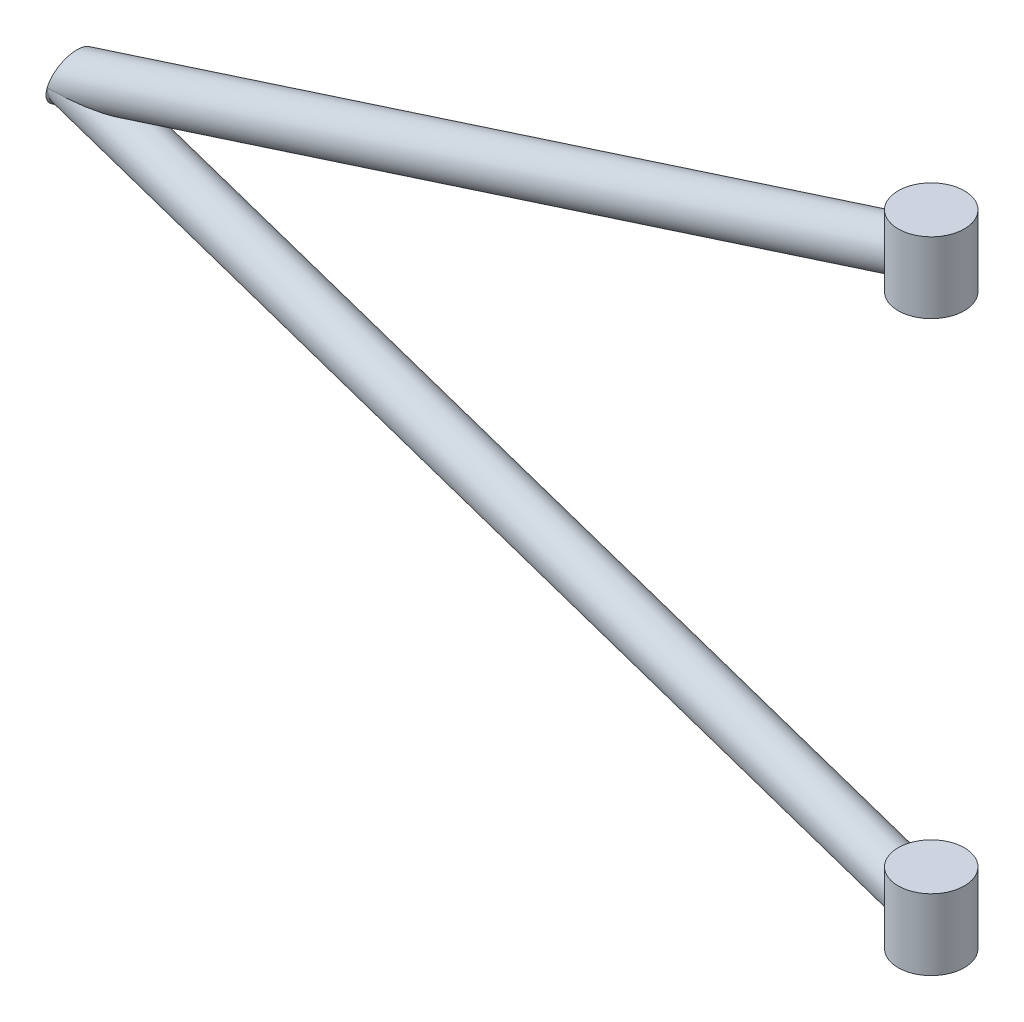
ISO-10303-21;
HEADER;
FILE_DESCRIPTION(('STEP AP214'),'2;1');
FILE_NAME('part.step','',(''),(''),'','','');
FILE_SCHEMA(('AUTOMOTIVE_DESIGN { 1 0 10303 214 1 1 1 1 }'));
ENDSEC;
DATA;
#1=APPLICATION_CONTEXT('core data for automotive mechanical design processes');
#2=APPLICATION_PROTOCOL_DEFINITION('international standard','automotive_design',2000,#1);
#3=PRODUCT_CONTEXT('',#1,'mechanical');
#4=PRODUCT('Part','Part','',(#3));
#5=PRODUCT_RELATED_PRODUCT_CATEGORY('part','',(#4));
#6=PRODUCT_DEFINITION_FORMATION('','',#4);
#7=PRODUCT_DEFINITION_CONTEXT('part definition',#1,'design');
#8=PRODUCT_DEFINITION('design','',#6,#7);
#9=PRODUCT_DEFINITION_SHAPE('','',#8);
#10=(LENGTH_UNIT() NAMED_UNIT(*) SI_UNIT(.MILLI.,.METRE.));
#11=(NAMED_UNIT(*) PLANE_ANGLE_UNIT() SI_UNIT($,.RADIAN.));
#12=(NAMED_UNIT(*) SI_UNIT($,.STERADIAN.) SOLID_ANGLE_UNIT());
#13=UNCERTAINTY_MEASURE_WITH_UNIT(LENGTH_MEASURE(1.E-05),#10,'distance_accuracy_value','');
#14=(GEOMETRIC_REPRESENTATION_CONTEXT(3) GLOBAL_UNCERTAINTY_ASSIGNED_CONTEXT((#13)) GLOBAL_UNIT_ASSIGNED_CONTEXT((#10,
#11,#12)) REPRESENTATION_CONTEXT('',''));
#15=CARTESIAN_POINT('',(0.,0.,0.));
#16=DIRECTION('',(0.,0.,1.));
#17=DIRECTION('',(1.,0.,0.));
#18=AXIS2_PLACEMENT_3D('',#15,#16,#17);
#19=CARTESIAN_POINT('',(-205.,-240.84,-42.383));
#20=DIRECTION('',(-0.959217140433101,0.280841487366859,-0.0321019699226643));
#21=DIRECTION('',(-0.280986308006609,-0.959711776895967,0.));
#22=AXIS2_PLACEMENT_3D('',#19,#20,#21);
#23=CYLINDRICAL_SURFACE('',#22,9.525);
#24=CARTESIAN_POINT('',(-218.994874606705,-246.667407757082,-42.7617937996007));
#25=CARTESIAN_POINT('',(-218.987955220855,-246.669433565251,-43.0174342762623));
#26=CARTESIAN_POINT('',(-218.97401688206,-246.662772486365,-43.27295474799));
#27=CARTESIAN_POINT('',(-218.932282379767,-246.632133179496,-43.7818138094207));
#28=CARTESIAN_POINT('',(-218.904486146226,-246.608154863986,-44.0351523880892));
#29=CARTESIAN_POINT('',(-218.835504698073,-246.543075469706,-44.5378028221887));
#30=CARTESIAN_POINT('',(-218.794317705473,-246.501972116916,-44.7871141382741));
#31=CARTESIAN_POINT('',(-218.699301450256,-246.402961792814,-45.2799146033767));
#32=CARTESIAN_POINT('',(-218.645472123492,-246.345054736238,-45.5234037228449));
#33=CARTESIAN_POINT('',(-218.526319202507,-246.213021164244,-46.0023119917565));
#34=CARTESIAN_POINT('',(-218.461026565887,-246.138938205086,-46.2377508856241));
#35=CARTESIAN_POINT('',(-218.320040046818,-245.974917515405,-46.6998139024592));
#36=CARTESIAN_POINT('',(-218.244346168744,-245.884979791551,-46.9264380291338));
#37=CARTESIAN_POINT('',(-218.08389833798,-245.689676950534,-47.3697005429419));
#38=CARTESIAN_POINT('',(-217.999141222411,-245.584306442881,-47.5863354060368));
#39=CARTESIAN_POINT('',(-217.822119282045,-245.358594623466,-48.0084459640598));
#40=CARTESIAN_POINT('',(-217.729854246826,-245.238252892057,-48.2139213459529));
#41=CARTESIAN_POINT('',(-217.534948518415,-244.976872080383,-48.6222837917232));
#42=CARTESIAN_POINT('',(-217.432022694602,-244.835118716989,-48.8245778697181));
#43=CARTESIAN_POINT('',(-217.221896241143,-244.535928211992,-49.2148648303007));
#44=CARTESIAN_POINT('',(-217.114695291446,-244.378489894835,-49.402856639099));
#45=CARTESIAN_POINT('',(-216.898362477643,-244.048180577292,-49.7635967071952));
#46=CARTESIAN_POINT('',(-216.789230433679,-243.875308133281,-49.9363435375497));
#47=CARTESIAN_POINT('',(-216.571660509932,-243.514353831896,-50.2656136509209));
#48=CARTESIAN_POINT('',(-216.463222541257,-243.326273965968,-50.4221390520658));
#49=CARTESIAN_POINT('',(-216.264220326347,-242.961298618952,-50.6981854444424));
#50=CARTESIAN_POINT('',(-216.173205475998,-242.78627233535,-50.8198556160698));
#51=CARTESIAN_POINT('',(-215.995970080119,-242.425218812917,-51.049584247466));
#52=CARTESIAN_POINT('',(-215.909748682027,-242.239193542585,-51.1576451321331));
#53=CARTESIAN_POINT('',(-215.744407552704,-241.856735287785,-51.3593412562569));
#54=CARTESIAN_POINT('',(-215.665280223016,-241.660313806317,-51.4529920093487));
#55=CARTESIAN_POINT('',(-215.516321457222,-241.257579756919,-51.6252921262342));
#56=CARTESIAN_POINT('',(-215.446489918048,-241.05126729869,-51.7039416563587));
#57=CARTESIAN_POINT('',(-215.317803840485,-240.628071385152,-51.8462034041527));
#58=CARTESIAN_POINT('',(-215.259046818851,-240.411113467368,-51.909683243731));
#59=CARTESIAN_POINT('',(-215.155219633012,-239.969861961161,-52.020286211168));
#60=CARTESIAN_POINT('',(-215.110149024423,-239.745568611173,-52.0674098701012));
#61=CARTESIAN_POINT('',(-215.035114059797,-239.291776283792,-52.1451418873722));
#62=CARTESIAN_POINT('',(-215.005141875268,-239.062280068711,-52.1757588049921));
#63=CARTESIAN_POINT('',(-214.960904175788,-238.60022316354,-52.2207532914588));
#64=CARTESIAN_POINT('',(-214.946637876694,-238.367662627028,-52.2351316710448));
#65=CARTESIAN_POINT('',(-214.934462330495,-237.931889003292,-52.2474060743877));
#66=CARTESIAN_POINT('',(-214.934674334689,-237.728774934088,-52.2471951922496));
#67=CARTESIAN_POINT('',(-214.946272200047,-237.3231667572,-52.2354973518725));
#68=CARTESIAN_POINT('',(-214.957662042179,-237.120672896176,-52.2240063762463));
#69=CARTESIAN_POINT('',(-215.007395627215,-236.515633118877,-52.173531168851));
#70=CARTESIAN_POINT('',(-215.06130394934,-236.115554578538,-52.11854409393));
#71=CARTESIAN_POINT('',(-215.186076494152,-235.417528598044,-51.9876791750984));
#72=CARTESIAN_POINT('',(-215.2503949685,-235.116858589203,-51.9192872042912));
#73=CARTESIAN_POINT('',(-215.394679087641,-234.524670152727,-51.7618103967004));
#74=CARTESIAN_POINT('',(-215.474652703699,-234.23315647542,-51.6727150138402));
#75=CARTESIAN_POINT('',(-215.646725198678,-233.659820147971,-51.474998603591));
#76=CARTESIAN_POINT('',(-215.738850563475,-233.378020413079,-51.3663347302394));
#77=CARTESIAN_POINT('',(-215.931829459448,-232.825465311702,-51.1304753857181));
#78=CARTESIAN_POINT('',(-216.03268171789,-232.554708343179,-51.0032826149703));
#79=CARTESIAN_POINT('',(-216.244044192548,-232.015286548897,-50.7258397779256));
#80=CARTESIAN_POINT('',(-216.354771601557,-231.747049849586,-50.5749232644513));
#81=CARTESIAN_POINT('',(-216.579772589072,-231.223977764963,-50.2536631642885));
#82=CARTESIAN_POINT('',(-216.694046579385,-230.969143945239,-50.083317315396));
#83=CARTESIAN_POINT('',(-216.923366646992,-230.474492862033,-49.7232209908667));
#84=CARTESIAN_POINT('',(-217.038411532887,-230.234656580738,-49.5334959281474));
#85=CARTESIAN_POINT('',(-217.266851998394,-229.771392873752,-49.1340926387977));
#86=CARTESIAN_POINT('',(-217.380247990623,-229.54796128426,-48.924419506577));
#87=CARTESIAN_POINT('',(-217.579029762873,-229.165450705871,-48.5316244719961));
#88=CARTESIAN_POINT('',(-217.665231156987,-229.002810444394,-48.352378047517));
#89=CARTESIAN_POINT('',(-217.833641429065,-228.690462230337,-47.981140996832));
#90=CARTESIAN_POINT('',(-217.91585042402,-228.540753898709,-47.7891507444516));
#91=CARTESIAN_POINT('',(-218.074741361708,-228.25606748022,-47.3926612102598));
#92=CARTESIAN_POINT('',(-218.151428657936,-228.121075058621,-47.1881744099565));
#93=CARTESIAN_POINT('',(-218.29779806036,-227.867582421436,-46.7668628644205));
#94=CARTESIAN_POINT('',(-218.367482456801,-227.749076809058,-46.5500421894554));
#95=CARTESIAN_POINT('',(-218.485650467373,-227.551651077602,-46.1476185131409));
#96=CARTESIAN_POINT('',(-218.53563334538,-227.469501743132,-45.9640373660615));
#97=CARTESIAN_POINT('',(-218.629100785317,-227.318477581283,-45.5899829371691));
#98=CARTESIAN_POINT('',(-218.672588961891,-227.249595363818,-45.399513562897));
#99=CARTESIAN_POINT('',(-218.752252884074,-227.126190758208,-45.0125514172378));
#100=CARTESIAN_POINT('',(-218.788431423442,-227.071662881378,-44.8160609803086));
#101=CARTESIAN_POINT('',(-218.852753563461,-226.977930863666,-44.4181481150666));
#102=CARTESIAN_POINT('',(-218.880897112861,-226.938726820525,-44.2167256553036));
#103=CARTESIAN_POINT('',(-218.928679422227,-226.876265296826,-43.809251974149));
#104=CARTESIAN_POINT('',(-218.948270097597,-226.853097557228,-43.6031812630704));
#105=CARTESIAN_POINT('',(-218.978310454204,-226.823570105098,-43.1891698130836));
#106=CARTESIAN_POINT('',(-218.988760137835,-226.817210388161,-42.9812290746653));
#107=CARTESIAN_POINT('',(-219.000359516121,-226.821442527581,-42.5652714040354));
#108=CARTESIAN_POINT('',(-219.001509581357,-226.832033708441,-42.3572544751904));
#109=CARTESIAN_POINT('',(-218.994615178529,-226.869928565337,-41.9429146229833));
#110=CARTESIAN_POINT('',(-218.986571029432,-226.897231661587,-41.7365916411051));
#111=CARTESIAN_POINT('',(-218.962695913651,-226.964973199112,-41.3445427845508));
#112=CARTESIAN_POINT('',(-218.947577939746,-227.004111468765,-41.1585458731584));
#113=CARTESIAN_POINT('',(-218.910349437195,-227.095258420623,-40.7903843252268));
#114=CARTESIAN_POINT('',(-218.888236318892,-227.147271867765,-40.6082211346407));
#115=CARTESIAN_POINT('',(-218.837551601546,-227.263364269701,-40.2487272936106));
#116=CARTESIAN_POINT('',(-218.808980288976,-227.327442689296,-40.0713964292054));
#117=CARTESIAN_POINT('',(-218.745977670174,-227.466803340716,-39.7222508201057));
#118=CARTESIAN_POINT('',(-218.711545112253,-227.542087965232,-39.550437262986));
#119=CARTESIAN_POINT('',(-218.622728814996,-227.734950479019,-39.1457876785846));
#120=CARTESIAN_POINT('',(-218.565853748616,-227.857447555666,-38.9158296783989));
#121=CARTESIAN_POINT('',(-218.443657560682,-228.120246039999,-38.4686868076348));
#122=CARTESIAN_POINT('',(-218.378333637436,-228.26055335338,-38.2515062090324));
#123=CARTESIAN_POINT('',(-218.24082479864,-228.557114147972,-37.8300016165915));
#124=CARTESIAN_POINT('',(-218.168626955244,-228.713397718229,-37.6257030988363));
#125=CARTESIAN_POINT('',(-218.019104613914,-229.039830739394,-37.230568586869));
#126=CARTESIAN_POINT('',(-217.941780020271,-229.20998044918,-37.0397328441282));
#127=CARTESIAN_POINT('',(-217.756482904016,-229.622868006897,-36.6085349683185));
#128=CARTESIAN_POINT('',(-217.647062349395,-229.870550541601,-36.3735169716761));
#129=CARTESIAN_POINT('',(-217.425182595827,-230.38525752037,-35.9272299852356));
#130=CARTESIAN_POINT('',(-217.312722228506,-230.652289469753,-35.7159702928534));
#131=CARTESIAN_POINT('',(-217.088064565252,-231.203818969118,-35.3167997932528));
#132=CARTESIAN_POINT('',(-216.975867672311,-231.488334657532,-35.1289138675296));
#133=CARTESIAN_POINT('',(-216.755395224082,-232.073018011347,-34.7768317138346));
#134=CARTESIAN_POINT('',(-216.647118699743,-232.373181763425,-34.6126296012574));
#135=CARTESIAN_POINT('',(-216.454406234015,-232.940752318867,-34.3318549159938));
#136=CARTESIAN_POINT('',(-216.3688665313,-233.206086249468,-34.2118415503272));
#137=CARTESIAN_POINT('',(-216.205967439459,-233.746693176062,-33.9898331929541));
#138=CARTESIAN_POINT('',(-216.128608512445,-234.021966732341,-33.8878392188995));
#139=CARTESIAN_POINT('',(-215.985235499978,-234.581122962146,-33.7032400231628));
#140=CARTESIAN_POINT('',(-215.9191958884,-234.864984520225,-33.6205910185409));
#141=CARTESIAN_POINT('',(-215.80159900805,-235.440871720266,-33.4760267330328));
#142=CARTESIAN_POINT('',(-215.750035840206,-235.732893983291,-33.4141030047293));
#143=CARTESIAN_POINT('',(-215.676905192425,-236.240227377303,-33.3272872777281));
#144=CARTESIAN_POINT('',(-215.650979709111,-236.453973932631,-33.2968773741922));
#145=CARTESIAN_POINT('',(-215.60968109802,-236.883877613221,-33.2486862411507));
#146=CARTESIAN_POINT('',(-215.594304889385,-237.100034015943,-33.2309013245342));
#147=CARTESIAN_POINT('',(-215.575202957371,-237.533330643838,-33.2088350761737));
#148=CARTESIAN_POINT('',(-215.571464084729,-237.750469480793,-33.2045385036277));
#149=CARTESIAN_POINT('',(-215.576363167326,-238.184447767104,-33.2101835426527));
#150=CARTESIAN_POINT('',(-215.585001047837,-238.401287218259,-33.2201250682583));
#151=CARTESIAN_POINT('',(-215.615021129072,-238.834140057687,-33.2549192507405));
#152=CARTESIAN_POINT('',(-215.636475425033,-239.050141761757,-33.2798562659302));
#153=CARTESIAN_POINT('',(-215.691880015547,-239.478208358916,-33.3449956381415));
#154=CARTESIAN_POINT('',(-215.725830398211,-239.690273224234,-33.3851981028016));
#155=CARTESIAN_POINT('',(-215.805346491976,-240.108849185084,-33.4808459835599));
#156=CARTESIAN_POINT('',(-215.850919778634,-240.315356560945,-33.5363013430204));
#157=CARTESIAN_POINT('',(-215.952270208059,-240.721194299711,-33.6620890751182));
#158=CARTESIAN_POINT('',(-216.008047417705,-240.920524615566,-33.7324215452642));
#159=CARTESIAN_POINT('',(-216.124007068695,-241.29763998662,-33.8821292506067));
#160=CARTESIAN_POINT('',(-216.183635036914,-241.475969795625,-33.9605690114552));
#161=CARTESIAN_POINT('',(-216.308765789964,-241.824841232675,-34.1293431665751));
#162=CARTESIAN_POINT('',(-216.374270831646,-241.995379830555,-34.2196821365417));
#163=CARTESIAN_POINT('',(-216.509608394393,-242.328169474287,-34.4116325064939));
#164=CARTESIAN_POINT('',(-216.579440826823,-242.490420689759,-34.5132436756345));
#165=CARTESIAN_POINT('',(-216.721972248591,-242.806398955979,-34.7271597596484));
#166=CARTESIAN_POINT('',(-216.7946715961,-242.960124935836,-34.8394660131836));
#167=CARTESIAN_POINT('',(-216.953697543643,-243.283586173855,-35.0936150954681));
#168=CARTESIAN_POINT('',(-217.040290357759,-243.451767586583,-35.2372717069915));
#169=CARTESIAN_POINT('',(-217.213484496451,-243.776166800388,-35.5375022808733));
#170=CARTESIAN_POINT('',(-217.300085821165,-243.932383670622,-35.6940772463171));
#171=CARTESIAN_POINT('',(-217.471535576771,-244.232811586343,-36.0194604022161));
#172=CARTESIAN_POINT('',(-217.55638281943,-244.377014681809,-36.1882765571573));
#173=CARTESIAN_POINT('',(-217.722614213895,-244.653135450678,-36.5372787255576));
#174=CARTESIAN_POINT('',(-217.803998221906,-244.78505261424,-36.7174652103431));
#175=CARTESIAN_POINT('',(-217.974015895891,-245.05585009394,-37.1171600004969));
#176=CARTESIAN_POINT('',(-218.061821971696,-245.192647870216,-37.3384378480672));
#177=CARTESIAN_POINT('',(-218.228703308562,-245.449151877488,-37.7938567126738));
#178=CARTESIAN_POINT('',(-218.30777760701,-245.568856224489,-38.0279991436801));
#179=CARTESIAN_POINT('',(-218.455283409938,-245.790618977176,-38.5076566952631));
#180=CARTESIAN_POINT('',(-218.523717465835,-245.892681613814,-38.7531690710653));
#181=CARTESIAN_POINT('',(-218.648293221363,-246.07861832479,-39.2539970636763));
#182=CARTESIAN_POINT('',(-218.704436161836,-246.162494235148,-39.509311687844));
#183=CARTESIAN_POINT('',(-218.799390563012,-246.306011060901,-40.0088420231831));
#184=CARTESIAN_POINT('',(-218.839173400375,-246.366981193358,-40.25249186614));
#185=CARTESIAN_POINT('',(-218.906072960397,-246.472419196217,-40.745046328112));
#186=CARTESIAN_POINT('',(-218.933190329246,-246.516887908495,-40.9939506783655));
#187=CARTESIAN_POINT('',(-218.974083757711,-246.588979214435,-41.4951977564587));
#188=CARTESIAN_POINT('',(-218.987863915045,-246.616606981334,-41.7475394040469));
#189=CARTESIAN_POINT('',(-219.001695459106,-246.654815387374,-42.2538914094954));
#190=CARTESIAN_POINT('',(-219.001746667061,-246.665395804532,-42.507901789042));
#191=CARTESIAN_POINT('',(-218.994874606705,-246.667407757082,-42.7617937996007));
#192=B_SPLINE_CURVE_WITH_KNOTS('',3,(#24,#25,#26,#27,#28,#29,#30,#31,#32,#33,#34,#35,#36,#37,
#38,#39,#40,#41,#42,#43,#44,#45,#46,#47,#48,#49,#50,#51,#52,#53,#54,#55,#56,#57,#58,#59,#60,#61,
#62,#63,#64,#65,#66,#67,#68,#69,#70,#71,#72,#73,#74,#75,#76,#77,#78,#79,#80,#81,#82,#83,#84,#85,
#86,#87,#88,#89,#90,#91,#92,#93,#94,#95,#96,#97,#98,#99,#100,#101,#102,#103,#104,#105,#106,#107,
#108,#109,#110,#111,#112,#113,#114,#115,#116,#117,#118,#119,#120,#121,#122,#123,#124,#125,#126,
#127,#128,#129,#130,#131,#132,#133,#134,#135,#136,#137,#138,#139,#140,#141,#142,#143,#144,#145,
#146,#147,#148,#149,#150,#151,#152,#153,#154,#155,#156,#157,#158,#159,#160,#161,#162,#163,#164,
#165,#166,#167,#168,#169,#170,#171,#172,#173,#174,#175,#176,#177,#178,#179,#180,#181,#182,#183,
#184,#185,#186,#187,#188,#189,#190,#191),.UNSPECIFIED.,.T.,.F.,(4,2,2,2,2,2,2,2,2,2,2,2,2,2,2,2,
2,2,2,2,2,2,2,2,2,2,2,2,2,2,2,2,2,2,2,2,2,2,2,2,2,2,2,2,2,2,2,2,2,2,2,2,2,2,2,2,2,2,2,2,2,2,2,2,
2,2,2,2,2,2,2,2,2,2,2,2,2,2,2,2,2,2,2,4),(0.,0.76698563468962,1.53397514600979,2.30106653769699,
3.06816182173112,3.83321650372924,4.59827086398211,5.36359308891207,6.12893677084033,
6.93085650990202,7.73283639640296,8.53489137447808,9.33684149117471,10.031519784673,
10.7260741249744,11.4198754111106,12.1136690040562,12.8133123083958,13.5129328936498,
14.2121903531151,14.9114128993034,15.5200993858166,16.1290027337185,17.346885394034,
18.2906983041853,19.2349930396231,20.1813810553746,21.1276312812303,22.1080300719604,
23.0885431296189,24.0677865092468,25.0467804740685,25.8169646805457,26.5871263045297,
27.3565308827029,28.1256830084401,28.7468220021784,29.3676140004621,29.9881682799652,
30.6087265175824,31.2327299881775,31.8567332952939,32.4807117363998,33.1046685311171,
33.6760668264775,34.2476769059869,34.819261635021,35.3909685814015,36.1898294634076,
36.988955934969,37.7896161916165,38.5902913998339,39.664414083481,40.7389556550929,
41.8146314679533,42.8900395505979,43.7998571423357,44.7097260999489,45.6175154216098,
46.5249342854521,47.1767259498987,47.828327181046,48.4791918869154,49.1300526630699,
49.7846096170129,50.4391711863992,51.0941604799888,51.7491540666941,52.3597719584374,
52.9706253450759,53.5814662242656,54.1923836607606,54.9042814784977,55.6162346258547,
56.328655221145,57.0411053673351,57.8638280660891,58.6866413734049,59.5092570735387,
60.3317896887067,61.0937926284626,61.8557566866966,62.6174865650874,63.3792263623368),.UNSPECIFIED.);
#193=CARTESIAN_POINT('',(-218.994874606705,-246.667407757082,-42.7617937996007));
#194=VERTEX_POINT('',#193);
#195=EDGE_CURVE('E80',#194,#194,#192,.T.);
#196=ORIENTED_EDGE('',*,*,#195,.F.);
#197=EDGE_LOOP('',(#196));
#198=FACE_BOUND('',#197,.T.);
#199=CARTESIAN_POINT('',(-582.,-130.461196,-55.));
#200=DIRECTION('',(-0.999148916524391,-0.0241519908144305,-0.0334383604238415));
#201=DIRECTION('',(-0.0241384766930597,0.999708298124858,-0.000807838621847062));
#202=AXIS2_PLACEMENT_3D('',#199,#200,#201);
#203=ELLIPSE('',#202,9.99799176513763,9.525);
#204=CARTESIAN_POINT('',(-581.681406682695,-130.461196,-64.5196703355824));
#205=VERTEX_POINT('',#204);
#206=CARTESIAN_POINT('',(-582.318593317305,-130.461196,-45.4803296644175));
#207=VERTEX_POINT('',#206);
#208=EDGE_CURVE('E86',#205,#207,#203,.T.);
#209=ORIENTED_EDGE('',*,*,#208,.F.);
#210=CARTESIAN_POINT('',(-582.,-130.461196,-55.));
#211=DIRECTION('',(-0.0241384766930597,0.999708298124858,-0.000807838621847062));
#212=DIRECTION('',(-0.999148916524391,-0.0241519908144305,-0.0334383604238415));
#213=AXIS2_PLACEMENT_3D('',#210,#211,#212);
#214=ELLIPSE('',#213,31.3384695712102,9.525);
#215=EDGE_CURVE('E93',#207,#205,#214,.T.);
#216=ORIENTED_EDGE('',*,*,#215,.F.);
#217=EDGE_LOOP('',(#209,#216));
#218=FACE_BOUND('',#217,.T.);
#219=ADVANCED_FACE('F67',(#198,#218),#23,.T.);
#220=CARTESIAN_POINT('',(-205.,0.,-42.383));
#221=DIRECTION('',(-0.944543865468033,-0.326860271521015,-0.0316109017257564));
#222=DIRECTION('',(0.327023701428977,-0.945016136742485,0.));
#223=AXIS2_PLACEMENT_3D('',#220,#221,#222);
#224=CYLINDRICAL_SURFACE('',#223,9.525);
#225=CARTESIAN_POINT('',(-218.988294025827,-14.9198549535932,-42.9553899431398));
#226=CARTESIAN_POINT('',(-218.9795532393,-14.9168289968205,-43.1689779347744));
#227=CARTESIAN_POINT('',(-218.965913202214,-14.9044775592774,-43.3822484171339));
#228=CARTESIAN_POINT('',(-218.929108192353,-14.8614406388761,-43.8061019707003));
#229=CARTESIAN_POINT('',(-218.905942151048,-14.8307530990868,-44.0166847376939));
#230=CARTESIAN_POINT('',(-218.850621964378,-14.751779116832,-44.4334906855485));
#231=CARTESIAN_POINT('',(-218.818460084523,-14.7034775191531,-44.6397099498849));
#232=CARTESIAN_POINT('',(-218.74593387056,-14.5903896138518,-45.0460650337511));
#233=CARTESIAN_POINT('',(-218.705569450073,-14.5256031326268,-45.2462007891907));
#234=CARTESIAN_POINT('',(-218.617953206529,-14.3815249037327,-45.6374060209985));
#235=CARTESIAN_POINT('',(-218.570768537575,-14.3023728565063,-45.8285422306743));
#236=CARTESIAN_POINT('',(-218.47017342393,-14.1305149411673,-46.2029555415863));
#237=CARTESIAN_POINT('',(-218.416760164322,-14.0378029399905,-46.3862290378076));
#238=CARTESIAN_POINT('',(-218.248599871147,-13.7413400132457,-46.9233997245039));
#239=CARTESIAN_POINT('',(-218.125887887786,-13.5191895133216,-47.2648385275419));
#240=CARTESIAN_POINT('',(-217.898179834513,-13.0947654680419,-47.8333908096183));
#241=CARTESIAN_POINT('',(-217.796136795794,-12.9008047538114,-48.0681089595276));
#242=CARTESIAN_POINT('',(-217.586700703246,-12.4936416496632,-48.5178555261049));
#243=CARTESIAN_POINT('',(-217.479305189019,-12.2804303735097,-48.7328747563519));
#244=CARTESIAN_POINT('',(-217.261483114035,-11.8370887637387,-49.1439373648122));
#245=CARTESIAN_POINT('',(-217.151050922894,-11.6069254579835,-49.3399419474576));
#246=CARTESIAN_POINT('',(-216.929674648254,-11.132101356028,-49.713068095957));
#247=CARTESIAN_POINT('',(-216.818730632495,-10.8874424302316,-49.8901920897978));
#248=CARTESIAN_POINT('',(-216.594923290414,-10.3768119542836,-50.2316163768544));
#249=CARTESIAN_POINT('',(-216.482117620736,-10.1104033533529,-50.3952998023793));
#250=CARTESIAN_POINT('',(-216.2608710657,-9.56488009392022,-50.7033811048569));
#251=CARTESIAN_POINT('',(-216.152430722796,-9.28576386544093,-50.8477765901439));
#252=CARTESIAN_POINT('',(-215.942774205847,-8.71596064359144,-51.1171163738872));
#253=CARTESIAN_POINT('',(-215.841552609054,-8.42528259674993,-51.2420753582621));
#254=CARTESIAN_POINT('',(-215.649382798559,-7.83291303100027,-51.472175122997));
#255=CARTESIAN_POINT('',(-215.558432112713,-7.53122418555342,-51.5773206764169));
#256=CARTESIAN_POINT('',(-215.409082082605,-6.98574077518012,-51.7457301584325));
#257=CARTESIAN_POINT('',(-215.34793907401,-6.74396521905804,-51.813109617992));
#258=CARTESIAN_POINT('',(-215.235998790061,-6.25468578755674,-51.9344999558221));
#259=CARTESIAN_POINT('',(-215.185201265798,-6.00718205015566,-51.9885111557363));
#260=CARTESIAN_POINT('',(-215.09613224277,-5.50760059457593,-52.0820870295431));
#261=CARTESIAN_POINT('',(-215.05784166402,-5.25553046865866,-52.121673719529));
#262=CARTESIAN_POINT('',(-214.995861993668,-4.74763891617153,-52.1852824904307));
#263=CARTESIAN_POINT('',(-214.972169571711,-4.49181835885174,-52.2093081214371));
#264=CARTESIAN_POINT('',(-214.944211585526,-4.02517174443517,-52.2375908497081));
#265=CARTESIAN_POINT('',(-214.937183830351,-3.81468118225875,-52.2446615162414));
#266=CARTESIAN_POINT('',(-214.935084958873,-3.39356878283463,-52.2467772157739));
#267=CARTESIAN_POINT('',(-214.940012490636,-3.1829469631226,-52.2418236085094));
#268=CARTESIAN_POINT('',(-214.962345132966,-2.7631938205147,-52.2192560059767));
#269=CARTESIAN_POINT('',(-214.979740514704,-2.55406146379543,-52.2016518820463));
#270=CARTESIAN_POINT('',(-215.027056783529,-2.13873690726105,-52.1533261896685));
#271=CARTESIAN_POINT('',(-215.056977752899,-1.93254472676975,-52.1226045350495));
#272=CARTESIAN_POINT('',(-215.128929082316,-1.52441816835658,-52.0477549035875));
#273=CARTESIAN_POINT('',(-215.170978110678,-1.32249087344402,-52.003606253271));
#274=CARTESIAN_POINT('',(-215.266185192306,-0.924718539063393,-51.9019432750101));
#275=CARTESIAN_POINT('',(-215.319343467889,-0.728873621405564,-51.8444286795846));
#276=CARTESIAN_POINT('',(-215.435433376836,-0.344343862903893,-51.7162311500701));
#277=CARTESIAN_POINT('',(-215.498373451316,-0.155665382928113,-51.6455368320411));
#278=CARTESIAN_POINT('',(-215.632352790391,0.21342417127113,-51.4914296232248));
#279=CARTESIAN_POINT('',(-215.703392305619,0.393834989412562,-51.4080163388269));
#280=CARTESIAN_POINT('',(-215.851603804651,0.745233544873624,-51.2292495043632));
#281=CARTESIAN_POINT('',(-215.928757317078,0.916247206732616,-51.1339314529963));
#282=CARTESIAN_POINT('',(-216.08768279504,1.24908947254759,-50.9316744613444));
#283=CARTESIAN_POINT('',(-216.169456572267,1.41091442286923,-50.8247309470999));
#284=CARTESIAN_POINT('',(-216.335946667149,1.72507824769356,-50.5998051539942));
#285=CARTESIAN_POINT('',(-216.420662918858,1.87741733457679,-50.4818231224243));
#286=CARTESIAN_POINT('',(-216.591513957017,2.17249908096614,-50.2353434629715));
#287=CARTESIAN_POINT('',(-216.677648895942,2.31524070048982,-50.1068446988288));
#288=CARTESIAN_POINT('',(-216.865962459525,2.61671852984387,-49.8149869348015));
#289=CARTESIAN_POINT('',(-216.968143250846,2.77348672663287,-49.6495911210125));
#290=CARTESIAN_POINT('',(-217.170372560154,3.07328128458491,-49.3055615825304));
#291=CARTESIAN_POINT('',(-217.270420876856,3.21630635297027,-49.1269266152612));
#292=CARTESIAN_POINT('',(-217.466510100599,3.48853186133428,-48.7571618846532));
#293=CARTESIAN_POINT('',(-217.562548751241,3.61772457960109,-48.5660252373404));
#294=CARTESIAN_POINT('',(-217.748810380933,3.86197957028304,-48.1722384952324));
#295=CARTESIAN_POINT('',(-217.839033321066,3.97704174814468,-47.9695883234085));
#296=CARTESIAN_POINT('',(-218.020795129574,4.2036296561464,-47.5327882536327));
#297=CARTESIAN_POINT('',(-218.111552835905,4.31363442656337,-47.297520627079));
#298=CARTESIAN_POINT('',(-218.282215618114,4.51577459427974,-46.81561726623));
#299=CARTESIAN_POINT('',(-218.362119903732,4.60790869058707,-46.5689807058883));
#300=CARTESIAN_POINT('',(-218.509399129552,4.77381838308143,-46.0660386015551));
#301=CARTESIAN_POINT('',(-218.576777040489,4.84759833351658,-45.8097353674857));
#302=CARTESIAN_POINT('',(-218.697629119254,4.97637374397307,-45.2892551294992));
#303=CARTESIAN_POINT('',(-218.751104166017,5.03137039153736,-45.0250786245049));
#304=CARTESIAN_POINT('',(-218.841242615102,5.12040456581695,-44.5014374212482));
#305=CARTESIAN_POINT('',(-218.878486552555,5.15518404998565,-44.2421986720033));
#306=CARTESIAN_POINT('',(-218.938460532382,5.20681640698633,-43.7202767110042));
#307=CARTESIAN_POINT('',(-218.961190872032,5.22366964699886,-43.4575935699124));
#308=CARTESIAN_POINT('',(-218.991761814876,5.23932170729907,-42.9308848078591));
#309=CARTESIAN_POINT('',(-218.999605690499,5.23812449605882,-42.6668594947402));
#310=CARTESIAN_POINT('',(-219.00036523468,5.21769417095871,-42.1394913345387));
#311=CARTESIAN_POINT('',(-218.993281288913,5.1984615230701,-41.8761484700002));
#312=CARTESIAN_POINT('',(-218.965132673081,5.14341044219872,-41.3643239279859));
#313=CARTESIAN_POINT('',(-218.94472955422,5.10839997774155,-41.1157180910365));
#314=CARTESIAN_POINT('',(-218.891107771833,5.02233233649368,-40.6227151701898));
#315=CARTESIAN_POINT('',(-218.857889584872,4.97127575643769,-40.3783179301367));
#316=CARTESIAN_POINT('',(-218.779383989957,4.85341568510812,-39.8953431065743));
#317=CARTESIAN_POINT('',(-218.734096843991,4.78661253565564,-39.6567653968608));
#318=CARTESIAN_POINT('',(-218.632415099335,4.63760067526224,-39.1869019498541));
#319=CARTESIAN_POINT('',(-218.576020141168,4.55539146574425,-38.9556164488373));
#320=CARTESIAN_POINT('',(-218.451661108968,4.37355657693939,-38.4957075822293));
#321=CARTESIAN_POINT('',(-218.383431260547,4.27352892481692,-38.2673150965866));
#322=CARTESIAN_POINT('',(-218.237934780693,4.0579841792591,-37.8209622702293));
#323=CARTESIAN_POINT('',(-218.160667998494,3.94246682739993,-37.6030021036455));
#324=CARTESIAN_POINT('',(-217.998659422388,3.6961488398386,-37.1785305085201));
#325=CARTESIAN_POINT('',(-217.913911110019,3.56533484371138,-36.9720293241207));
#326=CARTESIAN_POINT('',(-217.738826144978,3.28875163515195,-36.5718019315374));
#327=CARTESIAN_POINT('',(-217.648489325772,3.1429819769675,-36.3780761044048));
#328=CARTESIAN_POINT('',(-217.458666954064,2.82735962828148,-35.9931321739314));
#329=CARTESIAN_POINT('',(-217.358958928505,2.6565821496357,-35.8027802126662));
#330=CARTESIAN_POINT('',(-217.158256254141,2.29853384555397,-35.4389394112167));
#331=CARTESIAN_POINT('',(-217.057261446641,2.11126096862503,-35.2654526741799));
#332=CARTESIAN_POINT('',(-216.85717089187,1.72063336491805,-34.9368964798324));
#333=CARTESIAN_POINT('',(-216.758073195711,1.51729637908244,-34.7818071655912));
#334=CARTESIAN_POINT('',(-216.565090085336,1.09474502342893,-34.4912894728796));
#335=CARTESIAN_POINT('',(-216.471202962988,0.875535911782788,-34.3558546274752));
#336=CARTESIAN_POINT('',(-216.312915404095,0.474230460856054,-34.1348516588069));
#337=CARTESIAN_POINT('',(-216.246702533654,0.295207707956783,-34.044981303953));
#338=CARTESIAN_POINT('',(-216.12125545439,-0.071187080819002,-33.8783806763541));
#339=CARTESIAN_POINT('',(-216.062019701548,-0.258557256734734,-33.8016474946748));
#340=CARTESIAN_POINT('',(-215.95221851784,-0.640537826409069,-33.6619447075694));
#341=CARTESIAN_POINT('',(-215.901641886556,-0.835138464815448,-33.5989572928139));
#342=CARTESIAN_POINT('',(-215.810470332516,-1.23062396202225,-33.4869922828962));
#343=CARTESIAN_POINT('',(-215.769875540976,-1.43150890339444,-33.4380148719025));
#344=CARTESIAN_POINT('',(-215.699643732439,-1.83849747240627,-33.354122376486));
#345=CARTESIAN_POINT('',(-215.670028304595,-2.04461053939578,-33.3192349859128));
#346=CARTESIAN_POINT('',(-215.622436312355,-2.46003947652862,-33.2635048398484));
#347=CARTESIAN_POINT('',(-215.604459518713,-2.6693552835047,-33.2426618077262));
#348=CARTESIAN_POINT('',(-215.580183965736,-3.08970323266797,-33.2145730663161));
#349=CARTESIAN_POINT('',(-215.573893501983,-3.30073648734488,-33.2073370159484));
#350=CARTESIAN_POINT('',(-215.572584876982,-3.72289844802541,-33.2058307176705));
#351=CARTESIAN_POINT('',(-215.577569453798,-3.93402716476332,-33.2115636191788));
#352=CARTESIAN_POINT('',(-215.600928869998,-4.41463893439856,-33.2385623437058));
#353=CARTESIAN_POINT('',(-215.622691767403,-4.68373975819395,-33.2637623106285));
#354=CARTESIAN_POINT('',(-215.681299429272,-5.21791167734364,-33.332483726394));
#355=CARTESIAN_POINT('',(-215.718148798976,-5.48298151656728,-33.3760107698068));
#356=CARTESIAN_POINT('',(-215.804612827017,-6.00832380127219,-33.4799157529532));
#357=CARTESIAN_POINT('',(-215.854258642544,-6.26858285193916,-33.5403348528397));
#358=CARTESIAN_POINT('',(-215.963899432825,-6.78273567165525,-33.6766487016754));
#359=CARTESIAN_POINT('',(-216.023894789098,-7.03662920565491,-33.7525440211484));
#360=CARTESIAN_POINT('',(-216.178057804023,-7.63913896432164,-33.9525325920605));
#361=CARTESIAN_POINT('',(-216.276215290371,-7.98440219451083,-34.0836887840012));
#362=CARTESIAN_POINT('',(-216.483391722231,-8.66021160279111,-34.3727959337819));
#363=CARTESIAN_POINT('',(-216.592415546842,-8.9907510725044,-34.5307589507338));
#364=CARTESIAN_POINT('',(-216.816803775036,-9.63593999296951,-34.8726745075127));
#365=CARTESIAN_POINT('',(-216.932169566112,-9.95058593741734,-35.0566327485017));
#366=CARTESIAN_POINT('',(-217.165158327771,-10.5622785430085,-35.4503775116758));
#367=CARTESIAN_POINT('',(-217.282780458519,-10.8593315903863,-35.6601545754317));
#368=CARTESIAN_POINT('',(-217.491705446612,-11.3727597308103,-36.058711745441));
#369=CARTESIAN_POINT('',(-217.583301388106,-11.5928874274714,-36.2425144302092));
#370=CARTESIAN_POINT('',(-217.763667055911,-12.0193834731407,-36.6267973456956));
#371=CARTESIAN_POINT('',(-217.852436717551,-12.2257515074195,-36.8272779576582));
#372=CARTESIAN_POINT('',(-218.024973595665,-12.6223461933247,-37.2448155581634));
#373=CARTESIAN_POINT('',(-218.10875119045,-12.8126067052277,-37.4618358547249));
#374=CARTESIAN_POINT('',(-218.269350851997,-13.174977645744,-37.9129058352702));
#375=CARTESIAN_POINT('',(-218.34617271674,-13.3470875472243,-38.1469560135052));
#376=CARTESIAN_POINT('',(-218.523285276127,-13.7434987235154,-38.7421724818105));
#377=CARTESIAN_POINT('',(-218.618465697087,-13.9561756518298,-39.1129352772467));
#378=CARTESIAN_POINT('',(-218.740558524294,-14.2331673200307,-39.6929803936992));
#379=CARTESIAN_POINT('',(-218.777806741179,-14.3184865342928,-39.8902882172845));
#380=CARTESIAN_POINT('',(-218.844493133892,-14.4737624012685,-40.2922033416687));
#381=CARTESIAN_POINT('',(-218.873932222088,-14.5437208484698,-40.4968097865723));
#382=CARTESIAN_POINT('',(-218.920921066305,-14.659066575678,-40.885875386898));
#383=CARTESIAN_POINT('',(-218.939501713636,-14.7064394891099,-41.0696232894318));
#384=CARTESIAN_POINT('',(-218.969490077057,-14.7875213745241,-41.4406778756701));
#385=CARTESIAN_POINT('',(-218.980898952688,-14.8212325550393,-41.6279839790324));
#386=CARTESIAN_POINT('',(-218.996162919111,-14.8743391129277,-42.0048747877656));
#387=CARTESIAN_POINT('',(-219.000020208618,-14.8937386562417,-42.1944588137182));
#388=CARTESIAN_POINT('',(-218.99997962696,-14.9178451644035,-42.5745758131649));
#389=CARTESIAN_POINT('',(-218.996081009418,-14.9225507150858,-42.765108876228));
#390=CARTESIAN_POINT('',(-218.988294025827,-14.9198549535932,-42.9553899431398));
#391=B_SPLINE_CURVE_WITH_KNOTS('',3,(#225,#226,#227,#228,#229,#230,#231,#232,#233,#234,#235,
#236,#237,#238,#239,#240,#241,#242,#243,#244,#245,#246,#247,#248,#249,#250,#251,#252,#253,#254,
#255,#256,#257,#258,#259,#260,#261,#262,#263,#264,#265,#266,#267,#268,#269,#270,#271,#272,#273,
#274,#275,#276,#277,#278,#279,#280,#281,#282,#283,#284,#285,#286,#287,#288,#289,#290,#291,#292,
#293,#294,#295,#296,#297,#298,#299,#300,#301,#302,#303,#304,#305,#306,#307,#308,#309,#310,#311,
#312,#313,#314,#315,#316,#317,#318,#319,#320,#321,#322,#323,#324,#325,#326,#327,#328,#329,#330,
#331,#332,#333,#334,#335,#336,#337,#338,#339,#340,#341,#342,#343,#344,#345,#346,#347,#348,#349,
#350,#351,#352,#353,#354,#355,#356,#357,#358,#359,#360,#361,#362,#363,#364,#365,#366,#367,#368,
#369,#370,#371,#372,#373,#374,#375,#376,#377,#378,#379,#380,#381,#382,#383,#384,#385,#386,#387,
#388,#389,#390),.UNSPECIFIED.,.T.,.F.,(4,2,2,2,2,2,2,2,2,2,2,2,2,2,2,2,2,2,2,2,2,2,2,2,2,2,2,2,
2,2,2,2,2,2,2,2,2,2,2,2,2,2,2,2,2,2,2,2,2,2,2,2,2,2,2,2,2,2,2,2,2,2,2,2,2,2,2,2,2,2,2,2,2,2,2,2,
2,2,2,2,2,2,4),(0.,0.641136349844585,1.28234463542272,1.9241059261797,2.56587397561123,
3.20170634755587,3.83782719611657,5.10944684237207,6.07169988260367,7.03439940104625,
7.99902353164946,8.96352346446082,9.95988326696749,10.9563665016186,11.9520931126797,
12.9475795454717,13.7220273422596,14.4964565038341,15.2696986553036,16.0427643375856,
16.6743222311211,17.3058087097645,17.9368029668605,18.5678013691486,19.1997762775274,
19.8317638341577,20.4642998183934,21.0968553815346,21.7275678574778,22.358529387301,
22.9894767853407,23.6204924430784,24.3689572047263,25.117492303579,25.8664431064079,
26.6153989205151,27.4397199615026,28.2641009908786,29.0882862612103,29.9124194141543,
30.7040052251639,31.4955748219296,32.2869703911344,33.0783455140684,33.833130908446,
34.5878882366321,35.342629182315,36.0973945574457,36.8720554168344,37.6467292019564,
38.4220847304164,39.1974633749985,40.0199117446413,40.8424625450227,41.6641173023999,
42.4855010937431,43.1177945030299,43.7499477234443,44.3812769840496,45.012614543409,
45.6451870235962,46.2777470436731,46.9107559174196,47.5439185294103,48.356135783553,
49.1686011571632,49.9830637479293,50.7975563689162,51.9424375613898,53.0878351532101,
54.2334843397601,55.378715073172,56.2811475182346,57.1836005978711,58.0841068807579,
58.9846393091,60.2926658341986,60.946528902284,61.6003155435673,62.1716942869234,
62.7429806252676,63.3141006035338,63.8852755453024),.UNSPECIFIED.);
#392=CARTESIAN_POINT('',(-218.988294025827,-14.9198549535932,-42.9553899431398));
#393=VERTEX_POINT('',#392);
#394=EDGE_CURVE('E12',#393,#393,#391,.T.);
#395=ORIENTED_EDGE('',*,*,#394,.F.);
#396=EDGE_LOOP('',(#395));
#397=FACE_BOUND('',#396,.T.);
#398=CARTESIAN_POINT('',(-582.,-130.461196,-55.));
#399=DIRECTION('',(-0.959217140433101,0.280841487366859,-0.0321019699226643));
#400=DIRECTION('',(-0.280684343967154,-0.959754165905817,-0.00939361901282111));
#401=AXIS2_PLACEMENT_3D('',#398,#399,#400);
#402=ELLIPSE('',#401,11.6836542883766,9.525);
#403=EDGE_CURVE('E91',#205,#207,#402,.F.);
#404=ORIENTED_EDGE('',*,*,#403,.T.);
#405=ORIENTED_EDGE('',*,*,#215,.T.);
#406=EDGE_LOOP('',(#404,#405));
#407=FACE_BOUND('',#406,.T.);
#408=ADVANCED_FACE('F92',(#397,#407),#224,.T.);
#409=EDGE_CURVE('E97',#207,#205,#402,.F.);
#410=ORIENTED_EDGE('',*,*,#409,.T.);
#411=ORIENTED_EDGE('',*,*,#208,.T.);
#412=EDGE_LOOP('',(#410,#411));
#413=FACE_BOUND('',#412,.T.);
#414=ADVANCED_FACE('F102',(#413),#224,.T.);
#415=CARTESIAN_POINT('',(-582.,-130.461196,-55.));
#416=DIRECTION('',(-0.959217140433101,0.280841487366859,-0.0321019699226643));
#417=DIRECTION('',(-0.280986308006609,-0.959711776895967,0.));
#418=AXIS2_PLACEMENT_3D('',#415,#416,#417);
#419=PLANE('',#418);
#420=ORIENTED_EDGE('',*,*,#409,.F.);
#421=ORIENTED_EDGE('',*,*,#403,.F.);
#422=EDGE_LOOP('',(#420,#421));
#423=FACE_BOUND('',#422,.T.);
#424=ADVANCED_FACE('F69',(#423),#419,.T.);
#425=CARTESIAN_POINT('',(-205.,-255.84,-42.383));
#426=DIRECTION('',(0.,1.,0.));
#427=DIRECTION('',(0.,0.,1.));
#428=AXIS2_PLACEMENT_3D('',#425,#426,#427);
#429=PLANE('',#428);
#430=CARTESIAN_POINT('',(-205.,-255.84,-42.383));
#431=DIRECTION('',(0.,1.,0.));
#432=DIRECTION('',(0.,0.,1.));
#433=AXIS2_PLACEMENT_3D('',#430,#431,#432);
#434=CIRCLE('',#433,14.);
#435=CARTESIAN_POINT('',(-205.,-255.84,-28.383));
#436=VERTEX_POINT('',#435);
#437=EDGE_CURVE('E148',#436,#436,#434,.T.);
#438=ORIENTED_EDGE('',*,*,#437,.F.);
#439=EDGE_LOOP('',(#438));
#440=FACE_BOUND('',#439,.T.);
#441=ADVANCED_FACE('F121',(#440),#429,.F.);
#442=CARTESIAN_POINT('',(-205.,-225.84,-42.383));
#443=DIRECTION('',(0.,1.,0.));
#444=DIRECTION('',(0.,0.,1.));
#445=AXIS2_PLACEMENT_3D('',#442,#443,#444);
#446=PLANE('',#445);
#447=CARTESIAN_POINT('',(-205.,-225.84,-42.383));
#448=DIRECTION('',(0.,1.,0.));
#449=DIRECTION('',(0.,0.,1.));
#450=AXIS2_PLACEMENT_3D('',#447,#448,#449);
#451=CIRCLE('',#450,14.);
#452=CARTESIAN_POINT('',(-205.,-225.84,-28.383));
#453=VERTEX_POINT('',#452);
#454=EDGE_CURVE('E101',#453,#453,#451,.T.);
#455=ORIENTED_EDGE('',*,*,#454,.T.);
#456=EDGE_LOOP('',(#455));
#457=FACE_BOUND('',#456,.T.);
#458=ADVANCED_FACE('F116',(#457),#446,.T.);
#459=CARTESIAN_POINT('',(-205.,-255.84,-42.383));
#460=DIRECTION('',(0.,1.,0.));
#461=DIRECTION('',(0.,0.,1.));
#462=AXIS2_PLACEMENT_3D('',#459,#460,#461);
#463=CYLINDRICAL_SURFACE('',#462,14.);
#464=ORIENTED_EDGE('',*,*,#195,.T.);
#465=EDGE_LOOP('',(#464));
#466=FACE_BOUND('',#465,.T.);
#467=ORIENTED_EDGE('',*,*,#454,.F.);
#468=EDGE_LOOP('',(#467));
#469=FACE_BOUND('',#468,.T.);
#470=ORIENTED_EDGE('',*,*,#437,.T.);
#471=EDGE_LOOP('',(#470));
#472=FACE_BOUND('',#471,.T.);
#473=ADVANCED_FACE('F110',(#466,#469,#472),#463,.T.);
#474=CARTESIAN_POINT('',(-205.,-15.,-42.383));
#475=DIRECTION('',(0.,1.,0.));
#476=DIRECTION('',(0.,0.,1.));
#477=AXIS2_PLACEMENT_3D('',#474,#475,#476);
#478=PLANE('',#477);
#479=CARTESIAN_POINT('',(-205.,-15.,-42.383));
#480=DIRECTION('',(0.,1.,0.));
#481=DIRECTION('',(0.,0.,1.));
#482=AXIS2_PLACEMENT_3D('',#479,#480,#481);
#483=CIRCLE('',#482,14.);
#484=CARTESIAN_POINT('',(-205.,-15.,-28.383));
#485=VERTEX_POINT('',#484);
#486=EDGE_CURVE('E145',#485,#485,#483,.T.);
#487=ORIENTED_EDGE('',*,*,#486,.F.);
#488=EDGE_LOOP('',(#487));
#489=FACE_BOUND('',#488,.T.);
#490=ADVANCED_FACE('F115',(#489),#478,.F.);
#491=CARTESIAN_POINT('',(-205.,15.,-42.383));
#492=DIRECTION('',(0.,1.,0.));
#493=DIRECTION('',(0.,0.,1.));
#494=AXIS2_PLACEMENT_3D('',#491,#492,#493);
#495=PLANE('',#494);
#496=CARTESIAN_POINT('',(-205.,15.,-42.383));
#497=DIRECTION('',(0.,1.,0.));
#498=DIRECTION('',(0.,0.,1.));
#499=AXIS2_PLACEMENT_3D('',#496,#497,#498);
#500=CIRCLE('',#499,14.);
#501=CARTESIAN_POINT('',(-205.,15.,-28.383));
#502=VERTEX_POINT('',#501);
#503=EDGE_CURVE('E142',#502,#502,#500,.T.);
#504=ORIENTED_EDGE('',*,*,#503,.T.);
#505=EDGE_LOOP('',(#504));
#506=FACE_BOUND('',#505,.T.);
#507=ADVANCED_FACE('F138',(#506),#495,.T.);
#508=CARTESIAN_POINT('',(-205.,-15.,-42.383));
#509=DIRECTION('',(0.,1.,0.));
#510=DIRECTION('',(0.,0.,1.));
#511=AXIS2_PLACEMENT_3D('',#508,#509,#510);
#512=CYLINDRICAL_SURFACE('',#511,14.);
#513=ORIENTED_EDGE('',*,*,#394,.T.);
#514=EDGE_LOOP('',(#513));
#515=FACE_BOUND('',#514,.T.);
#516=ORIENTED_EDGE('',*,*,#503,.F.);
#517=EDGE_LOOP('',(#516));
#518=FACE_BOUND('',#517,.T.);
#519=ORIENTED_EDGE('',*,*,#486,.T.);
#520=EDGE_LOOP('',(#519));
#521=FACE_BOUND('',#520,.T.);
#522=ADVANCED_FACE('F125',(#515,#518,#521),#512,.T.);
#523=CLOSED_SHELL('',(#219,#408,#414,#424,#441,#458,#473,#490,#507,#522));
#524=MANIFOLD_SOLID_BREP('B2',#523);
#525=ADVANCED_BREP_SHAPE_REPRESENTATION('',(#18,#524),#14);
#526=SHAPE_DEFINITION_REPRESENTATION(#9,#525);
ENDSEC;
END-ISO-10303-21;
